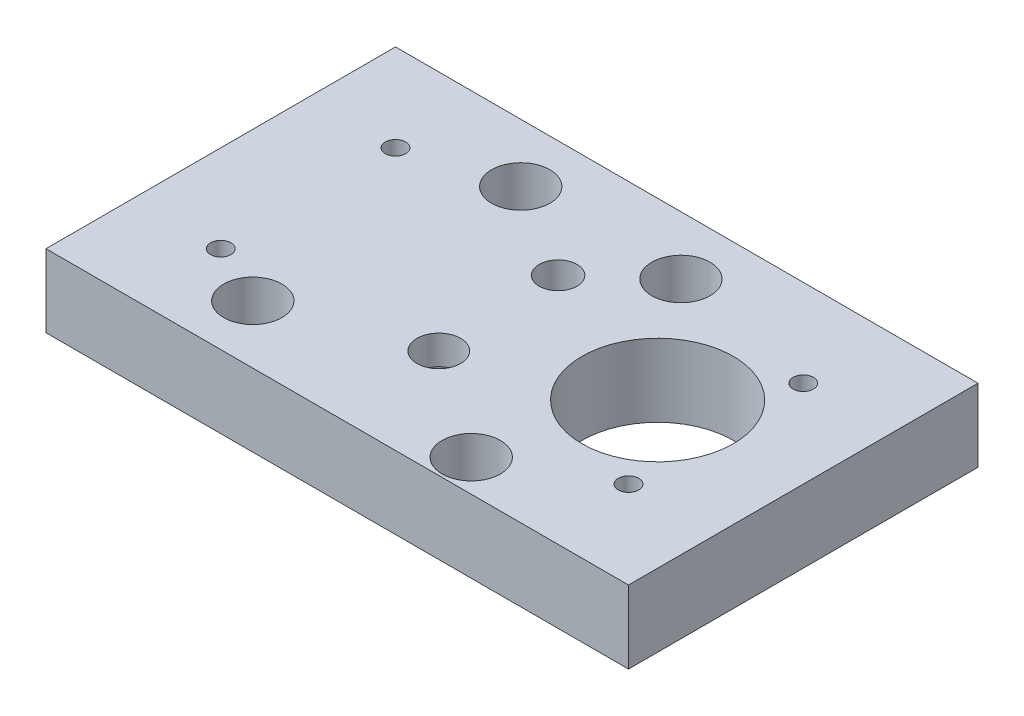
ISO-10303-21;
HEADER;
FILE_DESCRIPTION(('STEP AP214'),'2;1');
FILE_NAME('part.step','',(''),(''),'','','');
FILE_SCHEMA(('AUTOMOTIVE_DESIGN { 1 0 10303 214 1 1 1 1 }'));
ENDSEC;
DATA;
#1=APPLICATION_CONTEXT('core data for automotive mechanical design processes');
#2=APPLICATION_PROTOCOL_DEFINITION('international standard','automotive_design',2000,#1);
#3=PRODUCT_CONTEXT('',#1,'mechanical');
#4=PRODUCT('Part','Part','',(#3));
#5=PRODUCT_RELATED_PRODUCT_CATEGORY('part','',(#4));
#6=PRODUCT_DEFINITION_FORMATION('','',#4);
#7=PRODUCT_DEFINITION_CONTEXT('part definition',#1,'design');
#8=PRODUCT_DEFINITION('design','',#6,#7);
#9=PRODUCT_DEFINITION_SHAPE('','',#8);
#10=(LENGTH_UNIT() NAMED_UNIT(*) SI_UNIT(.MILLI.,.METRE.));
#11=(NAMED_UNIT(*) PLANE_ANGLE_UNIT() SI_UNIT($,.RADIAN.));
#12=(NAMED_UNIT(*) SI_UNIT($,.STERADIAN.) SOLID_ANGLE_UNIT());
#13=UNCERTAINTY_MEASURE_WITH_UNIT(LENGTH_MEASURE(1.E-05),#10,'distance_accuracy_value','');
#14=(GEOMETRIC_REPRESENTATION_CONTEXT(3) GLOBAL_UNCERTAINTY_ASSIGNED_CONTEXT((#13)) GLOBAL_UNIT_ASSIGNED_CONTEXT((#10,
#11,#12)) REPRESENTATION_CONTEXT('',''));
#15=CARTESIAN_POINT('',(0.,0.,0.));
#16=DIRECTION('',(0.,0.,1.));
#17=DIRECTION('',(1.,0.,0.));
#18=AXIS2_PLACEMENT_3D('',#15,#16,#17);
#19=CARTESIAN_POINT('',(6.3,0.,2.));
#20=DIRECTION('',(0.,1.,0.));
#21=DIRECTION('',(0.,0.,1.));
#22=AXIS2_PLACEMENT_3D('',#19,#20,#21);
#23=CYLINDRICAL_SURFACE('',#22,0.7);
#24=CARTESIAN_POINT('',(6.3,0.,2.));
#25=DIRECTION('',(0.,1.,0.));
#26=DIRECTION('',(0.,0.,1.));
#27=AXIS2_PLACEMENT_3D('',#24,#25,#26);
#28=CIRCLE('',#27,0.7);
#29=CARTESIAN_POINT('',(6.3,0.,2.7));
#30=VERTEX_POINT('',#29);
#31=EDGE_CURVE('E209',#30,#30,#28,.T.);
#32=ORIENTED_EDGE('',*,*,#31,.F.);
#33=EDGE_LOOP('',(#32));
#34=FACE_BOUND('',#33,.T.);
#35=CARTESIAN_POINT('',(6.3,1.,2.));
#36=DIRECTION('',(0.,1.,0.));
#37=DIRECTION('',(0.,0.,1.));
#38=AXIS2_PLACEMENT_3D('',#35,#36,#37);
#39=CIRCLE('',#38,0.7);
#40=CARTESIAN_POINT('',(6.3,1.,2.7));
#41=VERTEX_POINT('',#40);
#42=EDGE_CURVE('E92',#41,#41,#39,.F.);
#43=ORIENTED_EDGE('',*,*,#42,.F.);
#44=EDGE_LOOP('',(#43));
#45=FACE_BOUND('',#44,.T.);
#46=ADVANCED_FACE('F88',(#34,#45),#23,.F.);
#47=CARTESIAN_POINT('',(5.1,0.,10.));
#48=DIRECTION('',(0.,1.,0.));
#49=DIRECTION('',(0.,0.,1.));
#50=AXIS2_PLACEMENT_3D('',#47,#48,#49);
#51=CYLINDRICAL_SURFACE('',#50,0.700000000000001);
#52=CARTESIAN_POINT('',(5.1,0.,10.));
#53=DIRECTION('',(0.,1.,0.));
#54=DIRECTION('',(0.,0.,1.));
#55=AXIS2_PLACEMENT_3D('',#52,#53,#54);
#56=CIRCLE('',#55,0.700000000000001);
#57=CARTESIAN_POINT('',(5.1,0.,10.7));
#58=VERTEX_POINT('',#57);
#59=EDGE_CURVE('E206',#58,#58,#56,.T.);
#60=ORIENTED_EDGE('',*,*,#59,.F.);
#61=EDGE_LOOP('',(#60));
#62=FACE_BOUND('',#61,.T.);
#63=CARTESIAN_POINT('',(5.1,1.,10.));
#64=DIRECTION('',(0.,1.,0.));
#65=DIRECTION('',(0.,0.,1.));
#66=AXIS2_PLACEMENT_3D('',#63,#64,#65);
#67=CIRCLE('',#66,0.700000000000001);
#68=CARTESIAN_POINT('',(5.1,1.,10.7));
#69=VERTEX_POINT('',#68);
#70=EDGE_CURVE('E177',#69,#69,#67,.F.);
#71=ORIENTED_EDGE('',*,*,#70,.F.);
#72=EDGE_LOOP('',(#71));
#73=FACE_BOUND('',#72,.T.);
#74=ADVANCED_FACE('F251',(#62,#73),#51,.F.);
#75=CARTESIAN_POINT('',(11.8,0.,2.));
#76=DIRECTION('',(0.,1.,0.));
#77=DIRECTION('',(0.,0.,1.));
#78=AXIS2_PLACEMENT_3D('',#75,#76,#77);
#79=CYLINDRICAL_SURFACE('',#78,0.699999999999998);
#80=CARTESIAN_POINT('',(11.8,0.,2.));
#81=DIRECTION('',(0.,1.,0.));
#82=DIRECTION('',(0.,0.,1.));
#83=AXIS2_PLACEMENT_3D('',#80,#81,#82);
#84=CIRCLE('',#83,0.699999999999998);
#85=CARTESIAN_POINT('',(11.8,0.,2.7));
#86=VERTEX_POINT('',#85);
#87=EDGE_CURVE('E198',#86,#86,#84,.T.);
#88=ORIENTED_EDGE('',*,*,#87,.F.);
#89=EDGE_LOOP('',(#88));
#90=FACE_BOUND('',#89,.T.);
#91=CARTESIAN_POINT('',(11.8,1.,2.));
#92=DIRECTION('',(0.,1.,0.));
#93=DIRECTION('',(0.,0.,1.));
#94=AXIS2_PLACEMENT_3D('',#91,#92,#93);
#95=CIRCLE('',#94,0.699999999999998);
#96=CARTESIAN_POINT('',(11.8,1.,2.7));
#97=VERTEX_POINT('',#96);
#98=EDGE_CURVE('E174',#97,#97,#95,.F.);
#99=ORIENTED_EDGE('',*,*,#98,.F.);
#100=EDGE_LOOP('',(#99));
#101=FACE_BOUND('',#100,.T.);
#102=ADVANCED_FACE('F257',(#90,#101),#79,.F.);
#103=CARTESIAN_POINT('',(13.5,0.,10.9));
#104=DIRECTION('',(0.,1.,0.));
#105=DIRECTION('',(0.,0.,1.));
#106=AXIS2_PLACEMENT_3D('',#103,#104,#105);
#107=CYLINDRICAL_SURFACE('',#106,0.699999999999998);
#108=CARTESIAN_POINT('',(13.5,0.,10.9));
#109=DIRECTION('',(0.,1.,0.));
#110=DIRECTION('',(0.,0.,1.));
#111=AXIS2_PLACEMENT_3D('',#108,#109,#110);
#112=CIRCLE('',#111,0.699999999999998);
#113=CARTESIAN_POINT('',(13.5,0.,11.6));
#114=VERTEX_POINT('',#113);
#115=EDGE_CURVE('E195',#114,#114,#112,.T.);
#116=ORIENTED_EDGE('',*,*,#115,.F.);
#117=EDGE_LOOP('',(#116));
#118=FACE_BOUND('',#117,.T.);
#119=CARTESIAN_POINT('',(13.5,1.,10.9));
#120=DIRECTION('',(0.,1.,0.));
#121=DIRECTION('',(0.,0.,1.));
#122=AXIS2_PLACEMENT_3D('',#119,#120,#121);
#123=CIRCLE('',#122,0.699999999999998);
#124=CARTESIAN_POINT('',(13.5,1.,11.6));
#125=VERTEX_POINT('',#124);
#126=EDGE_CURVE('E171',#125,#125,#123,.F.);
#127=ORIENTED_EDGE('',*,*,#126,.F.);
#128=EDGE_LOOP('',(#127));
#129=FACE_BOUND('',#128,.T.);
#130=ADVANCED_FACE('F288',(#118,#129),#107,.F.);
#131=CARTESIAN_POINT('',(0.,2.5,0.));
#132=DIRECTION('',(0.,-1.,0.));
#133=DIRECTION('',(0.,0.,-1.));
#134=AXIS2_PLACEMENT_3D('',#131,#132,#133);
#135=PLANE('',#134);
#136=CARTESIAN_POINT('',(11.8,2.5,2.));
#137=DIRECTION('',(0.,1.,0.));
#138=DIRECTION('',(0.,0.,1.));
#139=AXIS2_PLACEMENT_3D('',#136,#137,#138);
#140=CIRCLE('',#139,1.);
#141=CARTESIAN_POINT('',(11.8,2.5,3.));
#142=VERTEX_POINT('',#141);
#143=EDGE_CURVE('E535',#142,#142,#140,.T.);
#144=ORIENTED_EDGE('',*,*,#143,.F.);
#145=EDGE_LOOP('',(#144));
#146=FACE_BOUND('',#145,.T.);
#147=CARTESIAN_POINT('',(13.5,2.5,10.9));
#148=DIRECTION('',(0.,1.,0.));
#149=DIRECTION('',(0.,0.,1.));
#150=AXIS2_PLACEMENT_3D('',#147,#148,#149);
#151=CIRCLE('',#150,1.);
#152=CARTESIAN_POINT('',(13.5,2.5,11.9));
#153=VERTEX_POINT('',#152);
#154=EDGE_CURVE('E541',#153,#153,#151,.T.);
#155=ORIENTED_EDGE('',*,*,#154,.F.);
#156=EDGE_LOOP('',(#155));
#157=FACE_BOUND('',#156,.T.);
#158=CARTESIAN_POINT('',(5.1,2.5,10.));
#159=DIRECTION('',(0.,1.,0.));
#160=DIRECTION('',(0.,0.,1.));
#161=AXIS2_PLACEMENT_3D('',#158,#159,#160);
#162=CIRCLE('',#161,1.);
#163=CARTESIAN_POINT('',(5.1,2.5,11.));
#164=VERTEX_POINT('',#163);
#165=EDGE_CURVE('E498',#164,#164,#162,.T.);
#166=ORIENTED_EDGE('',*,*,#165,.F.);
#167=EDGE_LOOP('',(#166));
#168=FACE_BOUND('',#167,.T.);
#169=CARTESIAN_POINT('',(6.3,2.5,2.));
#170=DIRECTION('',(0.,1.,0.));
#171=DIRECTION('',(0.,0.,1.));
#172=AXIS2_PLACEMENT_3D('',#169,#170,#171);
#173=CIRCLE('',#172,1.);
#174=CARTESIAN_POINT('',(6.3,2.5,3.));
#175=VERTEX_POINT('',#174);
#176=EDGE_CURVE('E496',#175,#175,#173,.T.);
#177=ORIENTED_EDGE('',*,*,#176,.F.);
#178=EDGE_LOOP('',(#177));
#179=FACE_BOUND('',#178,.T.);
#180=CARTESIAN_POINT('',(3.,2.5,9.));
#181=DIRECTION('',(0.,1.,0.));
#182=DIRECTION('',(0.,0.,1.));
#183=AXIS2_PLACEMENT_3D('',#180,#181,#182);
#184=CIRCLE('',#183,0.35);
#185=CARTESIAN_POINT('',(3.,2.5,9.35));
#186=VERTEX_POINT('',#185);
#187=EDGE_CURVE('E199',#186,#186,#184,.T.);
#188=ORIENTED_EDGE('',*,*,#187,.F.);
#189=EDGE_LOOP('',(#188));
#190=FACE_BOUND('',#189,.T.);
#191=CARTESIAN_POINT('',(3.,2.5,3.));
#192=DIRECTION('',(0.,1.,0.));
#193=DIRECTION('',(0.,0.,1.));
#194=AXIS2_PLACEMENT_3D('',#191,#192,#193);
#195=CIRCLE('',#194,0.35);
#196=CARTESIAN_POINT('',(3.,2.5,3.35));
#197=VERTEX_POINT('',#196);
#198=EDGE_CURVE('E205',#197,#197,#195,.T.);
#199=ORIENTED_EDGE('',*,*,#198,.F.);
#200=EDGE_LOOP('',(#199));
#201=FACE_BOUND('',#200,.T.);
#202=CARTESIAN_POINT('',(17.,2.5,3.));
#203=DIRECTION('',(0.,1.,0.));
#204=DIRECTION('',(0.,0.,1.));
#205=AXIS2_PLACEMENT_3D('',#202,#203,#204);
#206=CIRCLE('',#205,0.350000000000001);
#207=CARTESIAN_POINT('',(17.,2.5,3.35));
#208=VERTEX_POINT('',#207);
#209=EDGE_CURVE('E511',#208,#208,#206,.T.);
#210=ORIENTED_EDGE('',*,*,#209,.F.);
#211=EDGE_LOOP('',(#210));
#212=FACE_BOUND('',#211,.T.);
#213=CARTESIAN_POINT('',(17.,2.5,9.));
#214=DIRECTION('',(0.,1.,0.));
#215=DIRECTION('',(0.,0.,1.));
#216=AXIS2_PLACEMENT_3D('',#213,#214,#215);
#217=CIRCLE('',#216,0.350000000000001);
#218=CARTESIAN_POINT('',(17.,2.5,9.35));
#219=VERTEX_POINT('',#218);
#220=EDGE_CURVE('E186',#219,#219,#217,.T.);
#221=ORIENTED_EDGE('',*,*,#220,.F.);
#222=EDGE_LOOP('',(#221));
#223=FACE_BOUND('',#222,.T.);
#224=DIRECTION('',(1.,0.,0.));
#225=VECTOR('',#224,1.);
#226=CARTESIAN_POINT('',(0.,2.5,0.));
#227=LINE('',#226,#225);
#228=CARTESIAN_POINT('',(0.,2.5,0.));
#229=VERTEX_POINT('',#228);
#230=CARTESIAN_POINT('',(20.,2.5,0.));
#231=VERTEX_POINT('',#230);
#232=EDGE_CURVE('E154',#229,#231,#227,.T.);
#233=ORIENTED_EDGE('',*,*,#232,.F.);
#234=DIRECTION('',(0.,0.,1.));
#235=VECTOR('',#234,1.);
#236=CARTESIAN_POINT('',(0.,2.5,0.));
#237=LINE('',#236,#235);
#238=CARTESIAN_POINT('',(0.,2.5,12.));
#239=VERTEX_POINT('',#238);
#240=EDGE_CURVE('E142',#229,#239,#237,.T.);
#241=ORIENTED_EDGE('',*,*,#240,.T.);
#242=DIRECTION('',(1.,0.,0.));
#243=VECTOR('',#242,1.);
#244=CARTESIAN_POINT('',(0.,2.5,12.));
#245=LINE('',#244,#243);
#246=CARTESIAN_POINT('',(20.,2.5,12.));
#247=VERTEX_POINT('',#246);
#248=EDGE_CURVE('E136',#239,#247,#245,.T.);
#249=ORIENTED_EDGE('',*,*,#248,.T.);
#250=DIRECTION('',(0.,0.,1.));
#251=VECTOR('',#250,1.);
#252=CARTESIAN_POINT('',(20.,2.5,0.));
#253=LINE('',#252,#251);
#254=EDGE_CURVE('E141',#231,#247,#253,.T.);
#255=ORIENTED_EDGE('',*,*,#254,.F.);
#256=EDGE_LOOP('',(#233,#241,#249,#255));
#257=FACE_BOUND('',#256,.T.);
#258=CARTESIAN_POINT('',(9.58257569495584,2.5,4.));
#259=DIRECTION('',(0.,1.,0.));
#260=DIRECTION('',(0.,0.,1.));
#261=AXIS2_PLACEMENT_3D('',#258,#259,#260);
#262=CIRCLE('',#261,0.649999999999999);
#263=CARTESIAN_POINT('',(9.58257569495584,2.5,4.65));
#264=VERTEX_POINT('',#263);
#265=EDGE_CURVE('E164',#264,#264,#262,.T.);
#266=ORIENTED_EDGE('',*,*,#265,.F.);
#267=EDGE_LOOP('',(#266));
#268=FACE_BOUND('',#267,.T.);
#269=CARTESIAN_POINT('',(15.,2.5,6.));
#270=DIRECTION('',(0.,1.,0.));
#271=DIRECTION('',(0.,0.,1.));
#272=AXIS2_PLACEMENT_3D('',#269,#270,#271);
#273=CIRCLE('',#272,2.6);
#274=CARTESIAN_POINT('',(15.,2.5,8.6));
#275=VERTEX_POINT('',#274);
#276=EDGE_CURVE('E221',#275,#275,#273,.T.);
#277=ORIENTED_EDGE('',*,*,#276,.F.);
#278=EDGE_LOOP('',(#277));
#279=FACE_BOUND('',#278,.T.);
#280=CARTESIAN_POINT('',(9.78258800671495,2.5,8.29534574570485));
#281=DIRECTION('',(0.,-1.,0.));
#282=DIRECTION('',(0.,0.,-1.));
#283=AXIS2_PLACEMENT_3D('',#280,#281,#282);
#284=CIRCLE('',#283,0.75);
#285=CARTESIAN_POINT('',(9.78258800671495,2.5,7.54534574570485));
#286=VERTEX_POINT('',#285);
#287=EDGE_CURVE('E214',#286,#286,#284,.T.);
#288=ORIENTED_EDGE('',*,*,#287,.T.);
#289=EDGE_LOOP('',(#288));
#290=FACE_BOUND('',#289,.T.);
#291=ADVANCED_FACE('F139',(#146,#157,#168,#179,#190,#201,#212,#223,#257,#268,#279,#290),#135,.F.);
#292=CARTESIAN_POINT('',(0.,0.,0.));
#293=DIRECTION('',(0.,-1.,0.));
#294=DIRECTION('',(0.,0.,-1.));
#295=AXIS2_PLACEMENT_3D('',#292,#293,#294);
#296=PLANE('',#295);
#297=CARTESIAN_POINT('',(3.,0.,9.));
#298=DIRECTION('',(0.,1.,0.));
#299=DIRECTION('',(0.,0.,1.));
#300=AXIS2_PLACEMENT_3D('',#297,#298,#299);
#301=CIRCLE('',#300,0.35);
#302=CARTESIAN_POINT('',(3.,0.,9.35));
#303=VERTEX_POINT('',#302);
#304=EDGE_CURVE('E202',#303,#303,#301,.T.);
#305=ORIENTED_EDGE('',*,*,#304,.T.);
#306=EDGE_LOOP('',(#305));
#307=FACE_BOUND('',#306,.T.);
#308=ORIENTED_EDGE('',*,*,#115,.T.);
#309=EDGE_LOOP('',(#308));
#310=FACE_BOUND('',#309,.T.);
#311=ORIENTED_EDGE('',*,*,#87,.T.);
#312=EDGE_LOOP('',(#311));
#313=FACE_BOUND('',#312,.T.);
#314=ORIENTED_EDGE('',*,*,#59,.T.);
#315=EDGE_LOOP('',(#314));
#316=FACE_BOUND('',#315,.T.);
#317=CARTESIAN_POINT('',(3.,0.,3.));
#318=DIRECTION('',(0.,1.,0.));
#319=DIRECTION('',(0.,0.,1.));
#320=AXIS2_PLACEMENT_3D('',#317,#318,#319);
#321=CIRCLE('',#320,0.35);
#322=CARTESIAN_POINT('',(3.,0.,3.35));
#323=VERTEX_POINT('',#322);
#324=EDGE_CURVE('E508',#323,#323,#321,.T.);
#325=ORIENTED_EDGE('',*,*,#324,.T.);
#326=EDGE_LOOP('',(#325));
#327=FACE_BOUND('',#326,.T.);
#328=CARTESIAN_POINT('',(17.,0.,3.));
#329=DIRECTION('',(0.,1.,0.));
#330=DIRECTION('',(0.,0.,1.));
#331=AXIS2_PLACEMENT_3D('',#328,#329,#330);
#332=CIRCLE('',#331,0.350000000000001);
#333=CARTESIAN_POINT('',(17.,0.,3.35));
#334=VERTEX_POINT('',#333);
#335=EDGE_CURVE('E191',#334,#334,#332,.T.);
#336=ORIENTED_EDGE('',*,*,#335,.T.);
#337=EDGE_LOOP('',(#336));
#338=FACE_BOUND('',#337,.T.);
#339=CARTESIAN_POINT('',(17.,0.,9.));
#340=DIRECTION('',(0.,1.,0.));
#341=DIRECTION('',(0.,0.,1.));
#342=AXIS2_PLACEMENT_3D('',#339,#340,#341);
#343=CIRCLE('',#342,0.350000000000001);
#344=CARTESIAN_POINT('',(17.,0.,9.35));
#345=VERTEX_POINT('',#344);
#346=EDGE_CURVE('E182',#345,#345,#343,.T.);
#347=ORIENTED_EDGE('',*,*,#346,.T.);
#348=EDGE_LOOP('',(#347));
#349=FACE_BOUND('',#348,.T.);
#350=ORIENTED_EDGE('',*,*,#31,.T.);
#351=EDGE_LOOP('',(#350));
#352=FACE_BOUND('',#351,.T.);
#353=CARTESIAN_POINT('',(9.78258800671495,0.,8.29534574570485));
#354=DIRECTION('',(0.,1.,0.));
#355=DIRECTION('',(0.,0.,1.));
#356=AXIS2_PLACEMENT_3D('',#353,#354,#355);
#357=CIRCLE('',#356,1.6);
#358=CARTESIAN_POINT('',(9.78258800671495,0.,9.89534574570486));
#359=VERTEX_POINT('',#358);
#360=EDGE_CURVE('E224',#359,#359,#357,.T.);
#361=ORIENTED_EDGE('',*,*,#360,.T.);
#362=EDGE_LOOP('',(#361));
#363=FACE_BOUND('',#362,.T.);
#364=DIRECTION('',(1.,0.,0.));
#365=VECTOR('',#364,1.);
#366=CARTESIAN_POINT('',(0.,0.,0.));
#367=LINE('',#366,#365);
#368=CARTESIAN_POINT('',(0.,0.,0.));
#369=VERTEX_POINT('',#368);
#370=CARTESIAN_POINT('',(20.,0.,0.));
#371=VERTEX_POINT('',#370);
#372=EDGE_CURVE('E160',#369,#371,#367,.T.);
#373=ORIENTED_EDGE('',*,*,#372,.T.);
#374=DIRECTION('',(0.,0.,1.));
#375=VECTOR('',#374,1.);
#376=CARTESIAN_POINT('',(20.,0.,0.));
#377=LINE('',#376,#375);
#378=CARTESIAN_POINT('',(20.,0.,12.));
#379=VERTEX_POINT('',#378);
#380=EDGE_CURVE('E163',#371,#379,#377,.T.);
#381=ORIENTED_EDGE('',*,*,#380,.T.);
#382=DIRECTION('',(1.,0.,0.));
#383=VECTOR('',#382,1.);
#384=CARTESIAN_POINT('',(0.,0.,12.));
#385=LINE('',#384,#383);
#386=CARTESIAN_POINT('',(0.,0.,12.));
#387=VERTEX_POINT('',#386);
#388=EDGE_CURVE('E149',#387,#379,#385,.T.);
#389=ORIENTED_EDGE('',*,*,#388,.F.);
#390=DIRECTION('',(0.,0.,1.));
#391=VECTOR('',#390,1.);
#392=CARTESIAN_POINT('',(0.,0.,0.));
#393=LINE('',#392,#391);
#394=EDGE_CURVE('E123',#369,#387,#393,.T.);
#395=ORIENTED_EDGE('',*,*,#394,.F.);
#396=EDGE_LOOP('',(#373,#381,#389,#395));
#397=FACE_BOUND('',#396,.T.);
#398=CARTESIAN_POINT('',(9.58257569495584,0.,4.));
#399=DIRECTION('',(0.,1.,0.));
#400=DIRECTION('',(0.,0.,1.));
#401=AXIS2_PLACEMENT_3D('',#398,#399,#400);
#402=CIRCLE('',#401,0.649999999999999);
#403=CARTESIAN_POINT('',(9.58257569495584,0.,4.65));
#404=VERTEX_POINT('',#403);
#405=EDGE_CURVE('E229',#404,#404,#402,.T.);
#406=ORIENTED_EDGE('',*,*,#405,.T.);
#407=EDGE_LOOP('',(#406));
#408=FACE_BOUND('',#407,.T.);
#409=CARTESIAN_POINT('',(15.,0.,6.));
#410=DIRECTION('',(0.,1.,0.));
#411=DIRECTION('',(0.,0.,1.));
#412=AXIS2_PLACEMENT_3D('',#409,#410,#411);
#413=CIRCLE('',#412,2.6);
#414=CARTESIAN_POINT('',(15.,0.,8.6));
#415=VERTEX_POINT('',#414);
#416=EDGE_CURVE('E218',#415,#415,#413,.T.);
#417=ORIENTED_EDGE('',*,*,#416,.T.);
#418=EDGE_LOOP('',(#417));
#419=FACE_BOUND('',#418,.T.);
#420=ADVANCED_FACE('F234',(#307,#310,#313,#316,#327,#338,#349,#352,#363,#397,#408,#419),#296,.T.);
#421=CARTESIAN_POINT('',(0.,2.5,0.));
#422=DIRECTION('',(0.,0.,-1.));
#423=DIRECTION('',(-1.,0.,0.));
#424=AXIS2_PLACEMENT_3D('',#421,#422,#423);
#425=PLANE('',#424);
#426=ORIENTED_EDGE('',*,*,#372,.F.);
#427=DIRECTION('',(0.,-1.,0.));
#428=VECTOR('',#427,1.);
#429=CARTESIAN_POINT('',(0.,2.5,0.));
#430=LINE('',#429,#428);
#431=EDGE_CURVE('E98',#229,#369,#430,.T.);
#432=ORIENTED_EDGE('',*,*,#431,.F.);
#433=ORIENTED_EDGE('',*,*,#232,.T.);
#434=DIRECTION('',(0.,-1.,0.));
#435=VECTOR('',#434,1.);
#436=CARTESIAN_POINT('',(20.,2.5,0.));
#437=LINE('',#436,#435);
#438=EDGE_CURVE('E131',#231,#371,#437,.T.);
#439=ORIENTED_EDGE('',*,*,#438,.T.);
#440=EDGE_LOOP('',(#426,#432,#433,#439));
#441=FACE_BOUND('',#440,.T.);
#442=ADVANCED_FACE('F90',(#441),#425,.T.);
#443=CARTESIAN_POINT('',(0.,2.5,0.));
#444=DIRECTION('',(1.,0.,0.));
#445=DIRECTION('',(0.,0.,-1.));
#446=AXIS2_PLACEMENT_3D('',#443,#444,#445);
#447=PLANE('',#446);
#448=ORIENTED_EDGE('',*,*,#394,.T.);
#449=DIRECTION('',(0.,-1.,0.));
#450=VECTOR('',#449,1.);
#451=CARTESIAN_POINT('',(0.,2.5,12.));
#452=LINE('',#451,#450);
#453=EDGE_CURVE('E151',#239,#387,#452,.T.);
#454=ORIENTED_EDGE('',*,*,#453,.F.);
#455=ORIENTED_EDGE('',*,*,#240,.F.);
#456=ORIENTED_EDGE('',*,*,#431,.T.);
#457=EDGE_LOOP('',(#448,#454,#455,#456));
#458=FACE_BOUND('',#457,.T.);
#459=ADVANCED_FACE('F287',(#458),#447,.F.);
#460=CARTESIAN_POINT('',(0.,2.5,12.));
#461=DIRECTION('',(0.,0.,-1.));
#462=DIRECTION('',(-1.,0.,0.));
#463=AXIS2_PLACEMENT_3D('',#460,#461,#462);
#464=PLANE('',#463);
#465=ORIENTED_EDGE('',*,*,#388,.T.);
#466=DIRECTION('',(0.,-1.,0.));
#467=VECTOR('',#466,1.);
#468=CARTESIAN_POINT('',(20.,2.5,12.));
#469=LINE('',#468,#467);
#470=EDGE_CURVE('E146',#247,#379,#469,.T.);
#471=ORIENTED_EDGE('',*,*,#470,.F.);
#472=ORIENTED_EDGE('',*,*,#248,.F.);
#473=ORIENTED_EDGE('',*,*,#453,.T.);
#474=EDGE_LOOP('',(#465,#471,#472,#473));
#475=FACE_BOUND('',#474,.T.);
#476=ADVANCED_FACE('F147',(#475),#464,.F.);
#477=CARTESIAN_POINT('',(20.,2.5,0.));
#478=DIRECTION('',(1.,0.,0.));
#479=DIRECTION('',(0.,0.,-1.));
#480=AXIS2_PLACEMENT_3D('',#477,#478,#479);
#481=PLANE('',#480);
#482=ORIENTED_EDGE('',*,*,#380,.F.);
#483=ORIENTED_EDGE('',*,*,#438,.F.);
#484=ORIENTED_EDGE('',*,*,#254,.T.);
#485=ORIENTED_EDGE('',*,*,#470,.T.);
#486=EDGE_LOOP('',(#482,#483,#484,#485));
#487=FACE_BOUND('',#486,.T.);
#488=ADVANCED_FACE('F153',(#487),#481,.T.);
#489=CARTESIAN_POINT('',(9.58257569495584,2.5,4.));
#490=DIRECTION('',(0.,-1.,0.));
#491=DIRECTION('',(0.,0.,-1.));
#492=AXIS2_PLACEMENT_3D('',#489,#490,#491);
#493=CYLINDRICAL_SURFACE('',#492,0.649999999999999);
#494=ORIENTED_EDGE('',*,*,#265,.T.);
#495=EDGE_LOOP('',(#494));
#496=FACE_BOUND('',#495,.T.);
#497=ORIENTED_EDGE('',*,*,#405,.F.);
#498=EDGE_LOOP('',(#497));
#499=FACE_BOUND('',#498,.T.);
#500=ADVANCED_FACE('F237',(#496,#499),#493,.F.);
#501=CARTESIAN_POINT('',(9.78258800671495,2.5,8.29534574570485));
#502=DIRECTION('',(0.,-1.,0.));
#503=DIRECTION('',(0.,0.,-1.));
#504=AXIS2_PLACEMENT_3D('',#501,#502,#503);
#505=CYLINDRICAL_SURFACE('',#504,1.6);
#506=CARTESIAN_POINT('',(9.78258800671495,1.5,8.29534574570485));
#507=DIRECTION('',(0.,-1.,0.));
#508=DIRECTION('',(0.,0.,-1.));
#509=AXIS2_PLACEMENT_3D('',#506,#507,#508);
#510=CIRCLE('',#509,1.6);
#511=CARTESIAN_POINT('',(9.78258800671495,1.5,6.69534574570485));
#512=VERTEX_POINT('',#511);
#513=EDGE_CURVE('E12',#512,#512,#510,.T.);
#514=ORIENTED_EDGE('',*,*,#513,.F.);
#515=EDGE_LOOP('',(#514));
#516=FACE_BOUND('',#515,.T.);
#517=ORIENTED_EDGE('',*,*,#360,.F.);
#518=EDGE_LOOP('',(#517));
#519=FACE_BOUND('',#518,.T.);
#520=ADVANCED_FACE('F239',(#516,#519),#505,.F.);
#521=CARTESIAN_POINT('',(15.,2.5,6.));
#522=DIRECTION('',(0.,-1.,0.));
#523=DIRECTION('',(0.,0.,-1.));
#524=AXIS2_PLACEMENT_3D('',#521,#522,#523);
#525=CYLINDRICAL_SURFACE('',#524,2.6);
#526=ORIENTED_EDGE('',*,*,#276,.T.);
#527=EDGE_LOOP('',(#526));
#528=FACE_BOUND('',#527,.T.);
#529=ORIENTED_EDGE('',*,*,#416,.F.);
#530=EDGE_LOOP('',(#529));
#531=FACE_BOUND('',#530,.T.);
#532=ADVANCED_FACE('F246',(#528,#531),#525,.F.);
#533=CARTESIAN_POINT('',(9.78258800671495,1.5,8.29534574570485));
#534=DIRECTION('',(0.,-1.,0.));
#535=DIRECTION('',(0.,0.,-1.));
#536=AXIS2_PLACEMENT_3D('',#533,#534,#535);
#537=PLANE('',#536);
#538=ORIENTED_EDGE('',*,*,#513,.T.);
#539=EDGE_LOOP('',(#538));
#540=FACE_BOUND('',#539,.T.);
#541=CARTESIAN_POINT('',(9.78258800671495,1.5,8.29534574570485));
#542=DIRECTION('',(0.,-1.,0.));
#543=DIRECTION('',(0.,0.,-1.));
#544=AXIS2_PLACEMENT_3D('',#541,#542,#543);
#545=CIRCLE('',#544,0.75);
#546=CARTESIAN_POINT('',(9.78258800671495,1.5,7.54534574570485));
#547=VERTEX_POINT('',#546);
#548=EDGE_CURVE('E215',#547,#547,#545,.T.);
#549=ORIENTED_EDGE('',*,*,#548,.F.);
#550=EDGE_LOOP('',(#549));
#551=FACE_BOUND('',#550,.T.);
#552=ADVANCED_FACE('F268',(#540,#551),#537,.T.);
#553=CARTESIAN_POINT('',(9.78258800671495,1.5,8.29534574570485));
#554=DIRECTION('',(0.,1.,0.));
#555=DIRECTION('',(0.,0.,1.));
#556=AXIS2_PLACEMENT_3D('',#553,#554,#555);
#557=CYLINDRICAL_SURFACE('',#556,0.75);
#558=ORIENTED_EDGE('',*,*,#548,.T.);
#559=EDGE_LOOP('',(#558));
#560=FACE_BOUND('',#559,.T.);
#561=ORIENTED_EDGE('',*,*,#287,.F.);
#562=EDGE_LOOP('',(#561));
#563=FACE_BOUND('',#562,.T.);
#564=ADVANCED_FACE('F264',(#560,#563),#557,.F.);
#565=CARTESIAN_POINT('',(17.,0.,9.));
#566=DIRECTION('',(0.,1.,0.));
#567=DIRECTION('',(0.,0.,1.));
#568=AXIS2_PLACEMENT_3D('',#565,#566,#567);
#569=CYLINDRICAL_SURFACE('',#568,0.350000000000001);
#570=ORIENTED_EDGE('',*,*,#346,.F.);
#571=EDGE_LOOP('',(#570));
#572=FACE_BOUND('',#571,.T.);
#573=ORIENTED_EDGE('',*,*,#220,.T.);
#574=EDGE_LOOP('',(#573));
#575=FACE_BOUND('',#574,.T.);
#576=ADVANCED_FACE('F267',(#572,#575),#569,.F.);
#577=CARTESIAN_POINT('',(17.,0.,3.));
#578=DIRECTION('',(0.,1.,0.));
#579=DIRECTION('',(0.,0.,1.));
#580=AXIS2_PLACEMENT_3D('',#577,#578,#579);
#581=CYLINDRICAL_SURFACE('',#580,0.350000000000001);
#582=ORIENTED_EDGE('',*,*,#335,.F.);
#583=EDGE_LOOP('',(#582));
#584=FACE_BOUND('',#583,.T.);
#585=ORIENTED_EDGE('',*,*,#209,.T.);
#586=EDGE_LOOP('',(#585));
#587=FACE_BOUND('',#586,.T.);
#588=ADVANCED_FACE('F345',(#584,#587),#581,.F.);
#589=CARTESIAN_POINT('',(3.,0.,3.));
#590=DIRECTION('',(0.,1.,0.));
#591=DIRECTION('',(0.,0.,1.));
#592=AXIS2_PLACEMENT_3D('',#589,#590,#591);
#593=CYLINDRICAL_SURFACE('',#592,0.35);
#594=ORIENTED_EDGE('',*,*,#324,.F.);
#595=EDGE_LOOP('',(#594));
#596=FACE_BOUND('',#595,.T.);
#597=ORIENTED_EDGE('',*,*,#198,.T.);
#598=EDGE_LOOP('',(#597));
#599=FACE_BOUND('',#598,.T.);
#600=ADVANCED_FACE('F355',(#596,#599),#593,.F.);
#601=CARTESIAN_POINT('',(3.,0.,9.));
#602=DIRECTION('',(0.,1.,0.));
#603=DIRECTION('',(0.,0.,1.));
#604=AXIS2_PLACEMENT_3D('',#601,#602,#603);
#605=CYLINDRICAL_SURFACE('',#604,0.35);
#606=ORIENTED_EDGE('',*,*,#304,.F.);
#607=EDGE_LOOP('',(#606));
#608=FACE_BOUND('',#607,.T.);
#609=ORIENTED_EDGE('',*,*,#187,.T.);
#610=EDGE_LOOP('',(#609));
#611=FACE_BOUND('',#610,.T.);
#612=ADVANCED_FACE('F365',(#608,#611),#605,.F.);
#613=CARTESIAN_POINT('',(13.5,1.,10.9));
#614=DIRECTION('',(0.,1.,0.));
#615=DIRECTION('',(0.,0.,1.));
#616=AXIS2_PLACEMENT_3D('',#613,#614,#615);
#617=PLANE('',#616);
#618=CARTESIAN_POINT('',(13.5,1.,10.9));
#619=DIRECTION('',(0.,1.,0.));
#620=DIRECTION('',(0.,0.,1.));
#621=AXIS2_PLACEMENT_3D('',#618,#619,#620);
#622=CIRCLE('',#621,1.);
#623=CARTESIAN_POINT('',(13.5,1.,11.9));
#624=VERTEX_POINT('',#623);
#625=EDGE_CURVE('E538',#624,#624,#622,.T.);
#626=ORIENTED_EDGE('',*,*,#625,.T.);
#627=EDGE_LOOP('',(#626));
#628=FACE_BOUND('',#627,.T.);
#629=ORIENTED_EDGE('',*,*,#126,.T.);
#630=EDGE_LOOP('',(#629));
#631=FACE_BOUND('',#630,.T.);
#632=ADVANCED_FACE('F374',(#628,#631),#617,.T.);
#633=CARTESIAN_POINT('',(13.5,1.,10.9));
#634=DIRECTION('',(0.,1.,0.));
#635=DIRECTION('',(0.,0.,1.));
#636=AXIS2_PLACEMENT_3D('',#633,#634,#635);
#637=CYLINDRICAL_SURFACE('',#636,1.);
#638=ORIENTED_EDGE('',*,*,#625,.F.);
#639=EDGE_LOOP('',(#638));
#640=FACE_BOUND('',#639,.T.);
#641=ORIENTED_EDGE('',*,*,#154,.T.);
#642=EDGE_LOOP('',(#641));
#643=FACE_BOUND('',#642,.T.);
#644=ADVANCED_FACE('F417',(#640,#643),#637,.F.);
#645=CARTESIAN_POINT('',(11.8,1.,2.));
#646=DIRECTION('',(0.,1.,0.));
#647=DIRECTION('',(0.,0.,1.));
#648=AXIS2_PLACEMENT_3D('',#645,#646,#647);
#649=PLANE('',#648);
#650=CARTESIAN_POINT('',(11.8,1.,2.));
#651=DIRECTION('',(0.,1.,0.));
#652=DIRECTION('',(0.,0.,1.));
#653=AXIS2_PLACEMENT_3D('',#650,#651,#652);
#654=CIRCLE('',#653,1.);
#655=CARTESIAN_POINT('',(11.8,1.,3.));
#656=VERTEX_POINT('',#655);
#657=EDGE_CURVE('E532',#656,#656,#654,.T.);
#658=ORIENTED_EDGE('',*,*,#657,.T.);
#659=EDGE_LOOP('',(#658));
#660=FACE_BOUND('',#659,.T.);
#661=ORIENTED_EDGE('',*,*,#98,.T.);
#662=EDGE_LOOP('',(#661));
#663=FACE_BOUND('',#662,.T.);
#664=ADVANCED_FACE('F427',(#660,#663),#649,.T.);
#665=CARTESIAN_POINT('',(11.8,1.,2.));
#666=DIRECTION('',(0.,1.,0.));
#667=DIRECTION('',(0.,0.,1.));
#668=AXIS2_PLACEMENT_3D('',#665,#666,#667);
#669=CYLINDRICAL_SURFACE('',#668,1.);
#670=ORIENTED_EDGE('',*,*,#657,.F.);
#671=EDGE_LOOP('',(#670));
#672=FACE_BOUND('',#671,.T.);
#673=ORIENTED_EDGE('',*,*,#143,.T.);
#674=EDGE_LOOP('',(#673));
#675=FACE_BOUND('',#674,.T.);
#676=ADVANCED_FACE('F437',(#672,#675),#669,.F.);
#677=CARTESIAN_POINT('',(5.1,1.,10.));
#678=DIRECTION('',(0.,1.,0.));
#679=DIRECTION('',(0.,0.,1.));
#680=AXIS2_PLACEMENT_3D('',#677,#678,#679);
#681=PLANE('',#680);
#682=CARTESIAN_POINT('',(5.1,1.,10.));
#683=DIRECTION('',(0.,1.,0.));
#684=DIRECTION('',(0.,0.,1.));
#685=AXIS2_PLACEMENT_3D('',#682,#683,#684);
#686=CIRCLE('',#685,1.);
#687=CARTESIAN_POINT('',(5.1,1.,11.));
#688=VERTEX_POINT('',#687);
#689=EDGE_CURVE('E502',#688,#688,#686,.T.);
#690=ORIENTED_EDGE('',*,*,#689,.T.);
#691=EDGE_LOOP('',(#690));
#692=FACE_BOUND('',#691,.T.);
#693=ORIENTED_EDGE('',*,*,#70,.T.);
#694=EDGE_LOOP('',(#693));
#695=FACE_BOUND('',#694,.T.);
#696=ADVANCED_FACE('F447',(#692,#695),#681,.T.);
#697=CARTESIAN_POINT('',(5.1,1.,10.));
#698=DIRECTION('',(0.,1.,0.));
#699=DIRECTION('',(0.,0.,1.));
#700=AXIS2_PLACEMENT_3D('',#697,#698,#699);
#701=CYLINDRICAL_SURFACE('',#700,1.);
#702=ORIENTED_EDGE('',*,*,#689,.F.);
#703=EDGE_LOOP('',(#702));
#704=FACE_BOUND('',#703,.T.);
#705=ORIENTED_EDGE('',*,*,#165,.T.);
#706=EDGE_LOOP('',(#705));
#707=FACE_BOUND('',#706,.T.);
#708=ADVANCED_FACE('F457',(#704,#707),#701,.F.);
#709=CARTESIAN_POINT('',(6.3,1.,2.));
#710=DIRECTION('',(0.,1.,0.));
#711=DIRECTION('',(0.,0.,1.));
#712=AXIS2_PLACEMENT_3D('',#709,#710,#711);
#713=PLANE('',#712);
#714=CARTESIAN_POINT('',(6.3,1.,2.));
#715=DIRECTION('',(0.,1.,0.));
#716=DIRECTION('',(0.,0.,1.));
#717=AXIS2_PLACEMENT_3D('',#714,#715,#716);
#718=CIRCLE('',#717,1.);
#719=CARTESIAN_POINT('',(6.3,1.,3.));
#720=VERTEX_POINT('',#719);
#721=EDGE_CURVE('E175',#720,#720,#718,.T.);
#722=ORIENTED_EDGE('',*,*,#721,.T.);
#723=EDGE_LOOP('',(#722));
#724=FACE_BOUND('',#723,.T.);
#725=ORIENTED_EDGE('',*,*,#42,.T.);
#726=EDGE_LOOP('',(#725));
#727=FACE_BOUND('',#726,.T.);
#728=ADVANCED_FACE('F467',(#724,#727),#713,.T.);
#729=CARTESIAN_POINT('',(6.3,1.,2.));
#730=DIRECTION('',(0.,1.,0.));
#731=DIRECTION('',(0.,0.,1.));
#732=AXIS2_PLACEMENT_3D('',#729,#730,#731);
#733=CYLINDRICAL_SURFACE('',#732,1.);
#734=ORIENTED_EDGE('',*,*,#721,.F.);
#735=EDGE_LOOP('',(#734));
#736=FACE_BOUND('',#735,.T.);
#737=ORIENTED_EDGE('',*,*,#176,.T.);
#738=EDGE_LOOP('',(#737));
#739=FACE_BOUND('',#738,.T.);
#740=ADVANCED_FACE('F477',(#736,#739),#733,.F.);
#741=CLOSED_SHELL('',(#46,#74,#102,#130,#291,#420,#442,#459,#476,#488,#500,#520,#532,#552,#564,
#576,#588,#600,#612,#632,#644,#664,#676,#696,#708,#728,#740));
#742=MANIFOLD_SOLID_BREP('B2',#741);
#743=ADVANCED_BREP_SHAPE_REPRESENTATION('',(#18,#742),#14);
#744=SHAPE_DEFINITION_REPRESENTATION(#9,#743);
ENDSEC;
END-ISO-10303-21;
